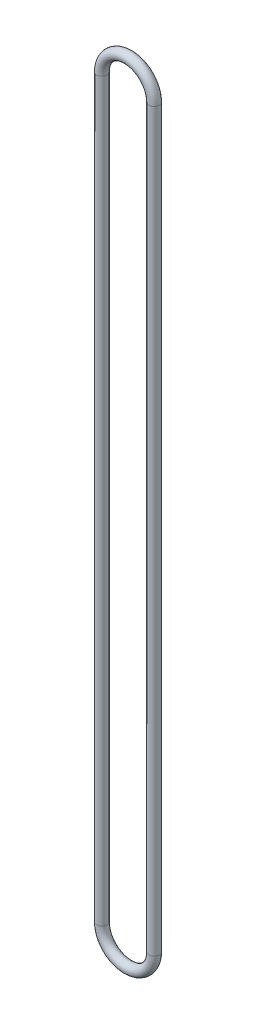
ISO-10303-21;
HEADER;
FILE_DESCRIPTION(('STEP AP214'),'2;1');
FILE_NAME('part.step','',(''),(''),'','','');
FILE_SCHEMA(('AUTOMOTIVE_DESIGN { 1 0 10303 214 1 1 1 1 }'));
ENDSEC;
DATA;
#1=APPLICATION_CONTEXT('core data for automotive mechanical design processes');
#2=APPLICATION_PROTOCOL_DEFINITION('international standard','automotive_design',2000,#1);
#3=PRODUCT_CONTEXT('',#1,'mechanical');
#4=PRODUCT('Part','Part','',(#3));
#5=PRODUCT_RELATED_PRODUCT_CATEGORY('part','',(#4));
#6=PRODUCT_DEFINITION_FORMATION('','',#4);
#7=PRODUCT_DEFINITION_CONTEXT('part definition',#1,'design');
#8=PRODUCT_DEFINITION('design','',#6,#7);
#9=PRODUCT_DEFINITION_SHAPE('','',#8);
#10=(LENGTH_UNIT() NAMED_UNIT(*) SI_UNIT(.MILLI.,.METRE.));
#11=(NAMED_UNIT(*) PLANE_ANGLE_UNIT() SI_UNIT($,.RADIAN.));
#12=(NAMED_UNIT(*) SI_UNIT($,.STERADIAN.) SOLID_ANGLE_UNIT());
#13=UNCERTAINTY_MEASURE_WITH_UNIT(LENGTH_MEASURE(1.E-05),#10,'distance_accuracy_value','');
#14=(GEOMETRIC_REPRESENTATION_CONTEXT(3) GLOBAL_UNCERTAINTY_ASSIGNED_CONTEXT((#13)) GLOBAL_UNIT_ASSIGNED_CONTEXT((#10,
#11,#12)) REPRESENTATION_CONTEXT('',''));
#15=CARTESIAN_POINT('',(0.,0.,0.));
#16=DIRECTION('',(0.,0.,1.));
#17=DIRECTION('',(1.,0.,0.));
#18=AXIS2_PLACEMENT_3D('',#15,#16,#17);
#19=CARTESIAN_POINT('',(0.,-1761.2,0.));
#20=DIRECTION('',(0.,0.,-1.));
#21=DIRECTION('',(-1.,0.,0.));
#22=AXIS2_PLACEMENT_3D('',#19,#20,#21);
#23=TOROIDAL_SURFACE('',#22,62.5,12.5);
#24=CARTESIAN_POINT('',(62.5,-1761.2,0.));
#25=DIRECTION('',(0.,-1.,0.));
#26=DIRECTION('',(0.,0.,1.));
#27=AXIS2_PLACEMENT_3D('',#24,#25,#26);
#28=CIRCLE('',#27,12.5);
#29=CARTESIAN_POINT('',(75.,-1761.2,0.));
#30=VERTEX_POINT('',#29);
#31=EDGE_CURVE('E10',#30,#30,#28,.T.);
#32=CARTESIAN_POINT('',(-62.5,-1761.2,0.));
#33=DIRECTION('',(0.,1.,0.));
#34=DIRECTION('',(0.,0.,1.));
#35=AXIS2_PLACEMENT_3D('',#32,#33,#34);
#36=CIRCLE('',#35,12.5);
#37=CARTESIAN_POINT('',(-75.,-1761.2,0.));
#38=VERTEX_POINT('',#37);
#39=EDGE_CURVE('E45',#38,#38,#36,.T.);
#40=CARTESIAN_POINT('',(0.,-1761.2,0.));
#41=DIRECTION('',(0.,0.,-1.));
#42=DIRECTION('',(-1.,0.,0.));
#43=AXIS2_PLACEMENT_3D('',#40,#41,#42);
#44=CIRCLE('',#43,75.);
#45=EDGE_CURVE('',#30,#38,#44,.T.);
#46=ORIENTED_EDGE('',*,*,#31,.T.);
#47=ORIENTED_EDGE('',*,*,#39,.F.);
#48=ORIENTED_EDGE('',*,*,#45,.T.);
#49=ORIENTED_EDGE('',*,*,#45,.F.);
#50=EDGE_LOOP('',(#46,#48,#47,#49));
#51=FACE_BOUND('',#50,.T.);
#52=ADVANCED_FACE('F31',(#51),#23,.T.);
#53=CARTESIAN_POINT('',(62.5,-4.44089209850063E-13,0.));
#54=DIRECTION('',(0.,-1.,0.));
#55=DIRECTION('',(0.,0.,-1.));
#56=AXIS2_PLACEMENT_3D('',#53,#54,#55);
#57=CYLINDRICAL_SURFACE('',#56,12.5);
#58=ORIENTED_EDGE('',*,*,#31,.F.);
#59=EDGE_LOOP('',(#58));
#60=FACE_BOUND('',#59,.T.);
#61=CARTESIAN_POINT('',(62.5,-4.44089209850063E-13,0.));
#62=DIRECTION('',(0.,-1.,0.));
#63=DIRECTION('',(0.,0.,1.));
#64=AXIS2_PLACEMENT_3D('',#61,#62,#63);
#65=CIRCLE('',#64,12.5);
#66=CARTESIAN_POINT('',(75.,-5.32907051820075E-13,0.));
#67=VERTEX_POINT('',#66);
#68=EDGE_CURVE('E37',#67,#67,#65,.T.);
#69=ORIENTED_EDGE('',*,*,#68,.T.);
#70=EDGE_LOOP('',(#69));
#71=FACE_BOUND('',#70,.T.);
#72=ADVANCED_FACE('F54',(#60,#71),#57,.T.);
#73=CARTESIAN_POINT('',(0.,0.,0.));
#74=DIRECTION('',(0.,0.,-1.));
#75=DIRECTION('',(-1.,0.,0.));
#76=AXIS2_PLACEMENT_3D('',#73,#74,#75);
#77=TOROIDAL_SURFACE('',#76,62.5,12.5);
#78=CARTESIAN_POINT('',(-62.5,4.44089209850063E-13,0.));
#79=DIRECTION('',(0.,1.,0.));
#80=DIRECTION('',(0.,0.,1.));
#81=AXIS2_PLACEMENT_3D('',#78,#79,#80);
#82=CIRCLE('',#81,12.5);
#83=CARTESIAN_POINT('',(-75.,5.32907051820075E-13,0.));
#84=VERTEX_POINT('',#83);
#85=EDGE_CURVE('E41',#84,#84,#82,.T.);
#86=CARTESIAN_POINT('',(0.,0.,0.));
#87=DIRECTION('',(0.,0.,-1.));
#88=DIRECTION('',(-1.,0.,0.));
#89=AXIS2_PLACEMENT_3D('',#86,#87,#88);
#90=CIRCLE('',#89,75.);
#91=EDGE_CURVE('',#84,#67,#90,.T.);
#92=ORIENTED_EDGE('',*,*,#85,.T.);
#93=ORIENTED_EDGE('',*,*,#68,.F.);
#94=ORIENTED_EDGE('',*,*,#91,.T.);
#95=ORIENTED_EDGE('',*,*,#91,.F.);
#96=EDGE_LOOP('',(#92,#94,#93,#95));
#97=FACE_BOUND('',#96,.T.);
#98=ADVANCED_FACE('F58',(#97),#77,.T.);
#99=CARTESIAN_POINT('',(-62.5,-1761.2,0.));
#100=DIRECTION('',(0.,1.,0.));
#101=DIRECTION('',(-1.,0.,0.));
#102=AXIS2_PLACEMENT_3D('',#99,#100,#101);
#103=CYLINDRICAL_SURFACE('',#102,12.5);
#104=ORIENTED_EDGE('',*,*,#85,.F.);
#105=EDGE_LOOP('',(#104));
#106=FACE_BOUND('',#105,.T.);
#107=ORIENTED_EDGE('',*,*,#39,.T.);
#108=EDGE_LOOP('',(#107));
#109=FACE_BOUND('',#108,.T.);
#110=ADVANCED_FACE('F51',(#106,#109),#103,.T.);
#111=CLOSED_SHELL('',(#52,#72,#98,#110));
#112=MANIFOLD_SOLID_BREP('B2',#111);
#113=ADVANCED_BREP_SHAPE_REPRESENTATION('',(#18,#112),#14);
#114=SHAPE_DEFINITION_REPRESENTATION(#9,#113);
ENDSEC;
END-ISO-10303-21;
